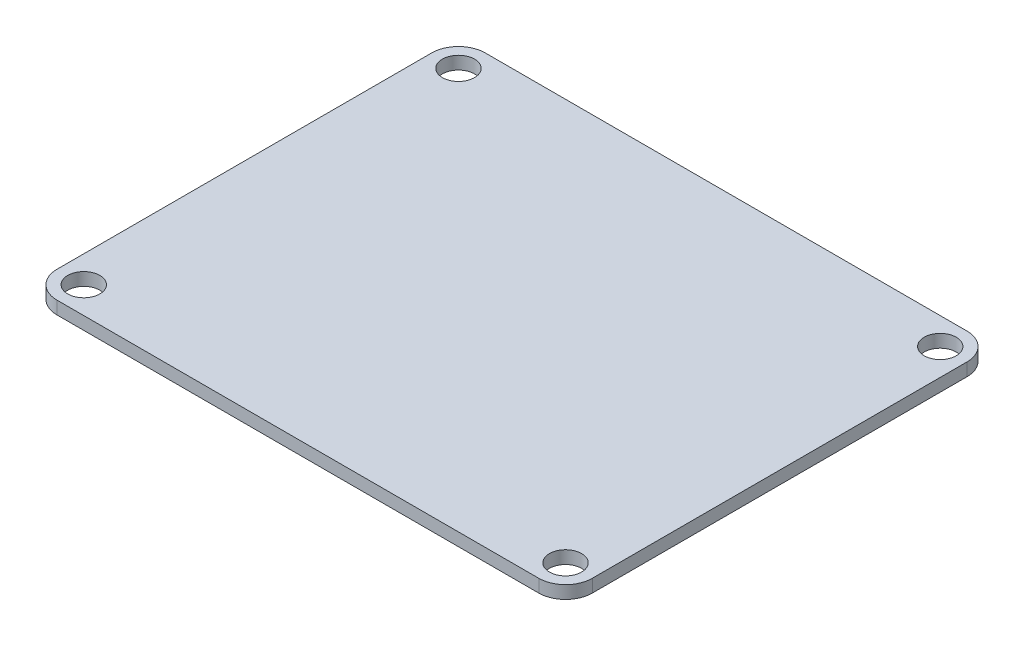
ISO-10303-21;
HEADER;
FILE_DESCRIPTION(('STEP AP214'),'2;1');
FILE_NAME('part.step','',(''),(''),'','','');
FILE_SCHEMA(('AUTOMOTIVE_DESIGN { 1 0 10303 214 1 1 1 1 }'));
ENDSEC;
DATA;
#1=APPLICATION_CONTEXT('core data for automotive mechanical design processes');
#2=APPLICATION_PROTOCOL_DEFINITION('international standard','automotive_design',2000,#1);
#3=PRODUCT_CONTEXT('',#1,'mechanical');
#4=PRODUCT('Part','Part','',(#3));
#5=PRODUCT_RELATED_PRODUCT_CATEGORY('part','',(#4));
#6=PRODUCT_DEFINITION_FORMATION('','',#4);
#7=PRODUCT_DEFINITION_CONTEXT('part definition',#1,'design');
#8=PRODUCT_DEFINITION('design','',#6,#7);
#9=PRODUCT_DEFINITION_SHAPE('','',#8);
#10=(LENGTH_UNIT() NAMED_UNIT(*) SI_UNIT(.MILLI.,.METRE.));
#11=(NAMED_UNIT(*) PLANE_ANGLE_UNIT() SI_UNIT($,.RADIAN.));
#12=(NAMED_UNIT(*) SI_UNIT($,.STERADIAN.) SOLID_ANGLE_UNIT());
#13=UNCERTAINTY_MEASURE_WITH_UNIT(LENGTH_MEASURE(1.E-05),#10,'distance_accuracy_value','');
#14=(GEOMETRIC_REPRESENTATION_CONTEXT(3) GLOBAL_UNCERTAINTY_ASSIGNED_CONTEXT((#13)) GLOBAL_UNIT_ASSIGNED_CONTEXT((#10,
#11,#12)) REPRESENTATION_CONTEXT('',''));
#15=CARTESIAN_POINT('',(0.,0.,0.));
#16=DIRECTION('',(0.,0.,1.));
#17=DIRECTION('',(1.,0.,0.));
#18=AXIS2_PLACEMENT_3D('',#15,#16,#17);
#19=CARTESIAN_POINT('',(-55.2139943562877,1.2,-17.0443805869234));
#20=DIRECTION('',(0.,-1.,0.));
#21=DIRECTION('',(0.,0.,-1.));
#22=AXIS2_PLACEMENT_3D('',#19,#20,#21);
#23=CYLINDRICAL_SURFACE('',#22,2.5);
#24=CARTESIAN_POINT('',(-55.2139943562877,0.,-17.0443805869234));
#25=DIRECTION('',(0.,1.,0.));
#26=DIRECTION('',(0.,0.,1.));
#27=AXIS2_PLACEMENT_3D('',#24,#25,#26);
#28=CIRCLE('',#27,2.5);
#29=CARTESIAN_POINT('',(-55.2139943562877,0.,-19.5443805869234));
#30=VERTEX_POINT('',#29);
#31=CARTESIAN_POINT('',(-57.7139943562877,0.,-17.0443805869234));
#32=VERTEX_POINT('',#31);
#33=EDGE_CURVE('E127',#30,#32,#28,.T.);
#34=ORIENTED_EDGE('',*,*,#33,.T.);
#35=DIRECTION('',(0.,-1.,0.));
#36=VECTOR('',#35,1.);
#37=CARTESIAN_POINT('',(-57.7139943562877,1.2,-17.0443805869234));
#38=LINE('',#37,#36);
#39=CARTESIAN_POINT('',(-57.7139943562877,1.2,-17.0443805869234));
#40=VERTEX_POINT('',#39);
#41=EDGE_CURVE('E11',#40,#32,#38,.T.);
#42=ORIENTED_EDGE('',*,*,#41,.F.);
#43=CARTESIAN_POINT('',(-55.2139943562877,1.2,-17.0443805869234));
#44=DIRECTION('',(0.,1.,0.));
#45=DIRECTION('',(0.,0.,1.));
#46=AXIS2_PLACEMENT_3D('',#43,#44,#45);
#47=CIRCLE('',#46,2.5);
#48=CARTESIAN_POINT('',(-55.2139943562877,1.2,-19.5443805869234));
#49=VERTEX_POINT('',#48);
#50=EDGE_CURVE('E142',#49,#40,#47,.T.);
#51=ORIENTED_EDGE('',*,*,#50,.F.);
#52=DIRECTION('',(0.,-1.,0.));
#53=VECTOR('',#52,1.);
#54=CARTESIAN_POINT('',(-55.2139943562877,1.2,-19.5443805869234));
#55=LINE('',#54,#53);
#56=EDGE_CURVE('E123',#49,#30,#55,.T.);
#57=ORIENTED_EDGE('',*,*,#56,.T.);
#58=EDGE_LOOP('',(#34,#42,#51,#57));
#59=FACE_BOUND('',#58,.T.);
#60=ADVANCED_FACE('F31',(#59),#23,.T.);
#61=CARTESIAN_POINT('',(-57.7139943562877,1.2,-17.0443805869234));
#62=DIRECTION('',(1.,0.,0.));
#63=DIRECTION('',(0.,0.,-1.));
#64=AXIS2_PLACEMENT_3D('',#61,#62,#63);
#65=PLANE('',#64);
#66=DIRECTION('',(0.,0.,1.));
#67=VECTOR('',#66,1.);
#68=CARTESIAN_POINT('',(-57.7139943562877,0.,-17.0443805869234));
#69=LINE('',#68,#67);
#70=CARTESIAN_POINT('',(-57.7139943562877,0.,17.9556194130766));
#71=VERTEX_POINT('',#70);
#72=EDGE_CURVE('E130',#32,#71,#69,.T.);
#73=ORIENTED_EDGE('',*,*,#72,.T.);
#74=DIRECTION('',(0.,-1.,0.));
#75=VECTOR('',#74,1.);
#76=CARTESIAN_POINT('',(-57.7139943562877,1.2,17.9556194130766));
#77=LINE('',#76,#75);
#78=CARTESIAN_POINT('',(-57.7139943562877,1.2,17.9556194130766));
#79=VERTEX_POINT('',#78);
#80=EDGE_CURVE('E39',#79,#71,#77,.T.);
#81=ORIENTED_EDGE('',*,*,#80,.F.);
#82=DIRECTION('',(0.,0.,1.));
#83=VECTOR('',#82,1.);
#84=CARTESIAN_POINT('',(-57.7139943562877,1.2,-17.0443805869234));
#85=LINE('',#84,#83);
#86=EDGE_CURVE('E90',#40,#79,#85,.T.);
#87=ORIENTED_EDGE('',*,*,#86,.F.);
#88=ORIENTED_EDGE('',*,*,#41,.T.);
#89=EDGE_LOOP('',(#73,#81,#87,#88));
#90=FACE_BOUND('',#89,.T.);
#91=ADVANCED_FACE('F232',(#90),#65,.F.);
#92=CARTESIAN_POINT('',(-55.2139943562877,1.2,17.9556194130766));
#93=DIRECTION('',(0.,-1.,0.));
#94=DIRECTION('',(0.,0.,-1.));
#95=AXIS2_PLACEMENT_3D('',#92,#93,#94);
#96=CYLINDRICAL_SURFACE('',#95,2.5);
#97=CARTESIAN_POINT('',(-55.2139943562877,0.,17.9556194130766));
#98=DIRECTION('',(0.,1.,0.));
#99=DIRECTION('',(0.,0.,1.));
#100=AXIS2_PLACEMENT_3D('',#97,#98,#99);
#101=CIRCLE('',#100,2.5);
#102=CARTESIAN_POINT('',(-55.2139943562877,0.,20.4556194130766));
#103=VERTEX_POINT('',#102);
#104=EDGE_CURVE('E133',#71,#103,#101,.T.);
#105=ORIENTED_EDGE('',*,*,#104,.T.);
#106=DIRECTION('',(0.,-1.,0.));
#107=VECTOR('',#106,1.);
#108=CARTESIAN_POINT('',(-55.2139943562877,1.2,20.4556194130766));
#109=LINE('',#108,#107);
#110=CARTESIAN_POINT('',(-55.2139943562877,1.2,20.4556194130766));
#111=VERTEX_POINT('',#110);
#112=EDGE_CURVE('E149',#111,#103,#109,.T.);
#113=ORIENTED_EDGE('',*,*,#112,.F.);
#114=CARTESIAN_POINT('',(-55.2139943562877,1.2,17.9556194130766));
#115=DIRECTION('',(0.,1.,0.));
#116=DIRECTION('',(0.,0.,1.));
#117=AXIS2_PLACEMENT_3D('',#114,#115,#116);
#118=CIRCLE('',#117,2.5);
#119=EDGE_CURVE('E157',#79,#111,#118,.T.);
#120=ORIENTED_EDGE('',*,*,#119,.F.);
#121=ORIENTED_EDGE('',*,*,#80,.T.);
#122=EDGE_LOOP('',(#105,#113,#120,#121));
#123=FACE_BOUND('',#122,.T.);
#124=ADVANCED_FACE('F155',(#123),#96,.T.);
#125=CARTESIAN_POINT('',(-55.2139943562877,1.2,20.4556194130766));
#126=DIRECTION('',(0.,0.,-1.));
#127=DIRECTION('',(-1.,0.,0.));
#128=AXIS2_PLACEMENT_3D('',#125,#126,#127);
#129=PLANE('',#128);
#130=DIRECTION('',(1.,0.,0.));
#131=VECTOR('',#130,1.);
#132=CARTESIAN_POINT('',(-55.2139943562877,0.,20.4556194130766));
#133=LINE('',#132,#131);
#134=CARTESIAN_POINT('',(-10.2139943562877,0.,20.4556194130766));
#135=VERTEX_POINT('',#134);
#136=EDGE_CURVE('E135',#103,#135,#133,.T.);
#137=ORIENTED_EDGE('',*,*,#136,.T.);
#138=DIRECTION('',(0.,-1.,0.));
#139=VECTOR('',#138,1.);
#140=CARTESIAN_POINT('',(-10.2139943562877,1.2,20.4556194130766));
#141=LINE('',#140,#139);
#142=CARTESIAN_POINT('',(-10.2139943562877,1.2,20.4556194130766));
#143=VERTEX_POINT('',#142);
#144=EDGE_CURVE('E146',#143,#135,#141,.T.);
#145=ORIENTED_EDGE('',*,*,#144,.F.);
#146=DIRECTION('',(1.,0.,0.));
#147=VECTOR('',#146,1.);
#148=CARTESIAN_POINT('',(-55.2139943562877,1.2,20.4556194130766));
#149=LINE('',#148,#147);
#150=EDGE_CURVE('E169',#111,#143,#149,.T.);
#151=ORIENTED_EDGE('',*,*,#150,.F.);
#152=ORIENTED_EDGE('',*,*,#112,.T.);
#153=EDGE_LOOP('',(#137,#145,#151,#152));
#154=FACE_BOUND('',#153,.T.);
#155=ADVANCED_FACE('F165',(#154),#129,.F.);
#156=CARTESIAN_POINT('',(-10.2139943562877,1.2,17.9556194130766));
#157=DIRECTION('',(0.,-1.,0.));
#158=DIRECTION('',(0.,0.,-1.));
#159=AXIS2_PLACEMENT_3D('',#156,#157,#158);
#160=CYLINDRICAL_SURFACE('',#159,2.5);
#161=CARTESIAN_POINT('',(-10.2139943562877,0.,17.9556194130766));
#162=DIRECTION('',(0.,1.,0.));
#163=DIRECTION('',(0.,0.,1.));
#164=AXIS2_PLACEMENT_3D('',#161,#162,#163);
#165=CIRCLE('',#164,2.5);
#166=CARTESIAN_POINT('',(-7.71399435628767,0.,17.9556194130766));
#167=VERTEX_POINT('',#166);
#168=EDGE_CURVE('E137',#135,#167,#165,.T.);
#169=ORIENTED_EDGE('',*,*,#168,.T.);
#170=DIRECTION('',(0.,-1.,0.));
#171=VECTOR('',#170,1.);
#172=CARTESIAN_POINT('',(-7.71399435628767,1.2,17.9556194130766));
#173=LINE('',#172,#171);
#174=CARTESIAN_POINT('',(-7.71399435628767,1.2,17.9556194130766));
#175=VERTEX_POINT('',#174);
#176=EDGE_CURVE('E118',#175,#167,#173,.T.);
#177=ORIENTED_EDGE('',*,*,#176,.F.);
#178=CARTESIAN_POINT('',(-10.2139943562877,1.2,17.9556194130766));
#179=DIRECTION('',(0.,1.,0.));
#180=DIRECTION('',(0.,0.,1.));
#181=AXIS2_PLACEMENT_3D('',#178,#179,#180);
#182=CIRCLE('',#181,2.5);
#183=EDGE_CURVE('E109',#143,#175,#182,.T.);
#184=ORIENTED_EDGE('',*,*,#183,.F.);
#185=ORIENTED_EDGE('',*,*,#144,.T.);
#186=EDGE_LOOP('',(#169,#177,#184,#185));
#187=FACE_BOUND('',#186,.T.);
#188=ADVANCED_FACE('F168',(#187),#160,.T.);
#189=CARTESIAN_POINT('',(-7.71399435628767,1.2,-17.0443805869234));
#190=DIRECTION('',(-1.,0.,0.));
#191=DIRECTION('',(0.,0.,1.));
#192=AXIS2_PLACEMENT_3D('',#189,#190,#191);
#193=PLANE('',#192);
#194=DIRECTION('',(0.,0.,-1.));
#195=VECTOR('',#194,1.);
#196=CARTESIAN_POINT('',(-7.71399435628767,0.,-17.0443805869234));
#197=LINE('',#196,#195);
#198=CARTESIAN_POINT('',(-7.71399435628767,0.,-17.0443805869234));
#199=VERTEX_POINT('',#198);
#200=EDGE_CURVE('E117',#167,#199,#197,.T.);
#201=ORIENTED_EDGE('',*,*,#200,.T.);
#202=DIRECTION('',(0.,-1.,0.));
#203=VECTOR('',#202,1.);
#204=CARTESIAN_POINT('',(-7.71399435628767,1.2,-17.0443805869234));
#205=LINE('',#204,#203);
#206=CARTESIAN_POINT('',(-7.71399435628767,1.2,-17.0443805869234));
#207=VERTEX_POINT('',#206);
#208=EDGE_CURVE('E114',#207,#199,#205,.T.);
#209=ORIENTED_EDGE('',*,*,#208,.F.);
#210=DIRECTION('',(0.,0.,-1.));
#211=VECTOR('',#210,1.);
#212=CARTESIAN_POINT('',(-7.71399435628767,1.2,-17.0443805869234));
#213=LINE('',#212,#211);
#214=EDGE_CURVE('E103',#175,#207,#213,.T.);
#215=ORIENTED_EDGE('',*,*,#214,.F.);
#216=ORIENTED_EDGE('',*,*,#176,.T.);
#217=EDGE_LOOP('',(#201,#209,#215,#216));
#218=FACE_BOUND('',#217,.T.);
#219=ADVANCED_FACE('F115',(#218),#193,.F.);
#220=CARTESIAN_POINT('',(-10.2139943562877,1.2,-17.0443805869234));
#221=DIRECTION('',(0.,-1.,0.));
#222=DIRECTION('',(0.,0.,-1.));
#223=AXIS2_PLACEMENT_3D('',#220,#221,#222);
#224=CYLINDRICAL_SURFACE('',#223,2.5);
#225=CARTESIAN_POINT('',(-10.2139943562877,0.,-17.0443805869234));
#226=DIRECTION('',(0.,1.,0.));
#227=DIRECTION('',(0.,0.,1.));
#228=AXIS2_PLACEMENT_3D('',#225,#226,#227);
#229=CIRCLE('',#228,2.5);
#230=CARTESIAN_POINT('',(-10.2139943562877,0.,-19.5443805869234));
#231=VERTEX_POINT('',#230);
#232=EDGE_CURVE('E76',#199,#231,#229,.T.);
#233=ORIENTED_EDGE('',*,*,#232,.T.);
#234=DIRECTION('',(0.,-1.,0.));
#235=VECTOR('',#234,1.);
#236=CARTESIAN_POINT('',(-10.2139943562877,1.2,-19.5443805869234));
#237=LINE('',#236,#235);
#238=CARTESIAN_POINT('',(-10.2139943562877,1.2,-19.5443805869234));
#239=VERTEX_POINT('',#238);
#240=EDGE_CURVE('E119',#239,#231,#237,.T.);
#241=ORIENTED_EDGE('',*,*,#240,.F.);
#242=CARTESIAN_POINT('',(-10.2139943562877,1.2,-17.0443805869234));
#243=DIRECTION('',(0.,1.,0.));
#244=DIRECTION('',(0.,0.,1.));
#245=AXIS2_PLACEMENT_3D('',#242,#243,#244);
#246=CIRCLE('',#245,2.5);
#247=EDGE_CURVE('E107',#207,#239,#246,.T.);
#248=ORIENTED_EDGE('',*,*,#247,.F.);
#249=ORIENTED_EDGE('',*,*,#208,.T.);
#250=EDGE_LOOP('',(#233,#241,#248,#249));
#251=FACE_BOUND('',#250,.T.);
#252=ADVANCED_FACE('F121',(#251),#224,.T.);
#253=CARTESIAN_POINT('',(-55.2139943562877,1.2,-19.5443805869234));
#254=DIRECTION('',(0.,0.,1.));
#255=DIRECTION('',(1.,0.,0.));
#256=AXIS2_PLACEMENT_3D('',#253,#254,#255);
#257=PLANE('',#256);
#258=DIRECTION('',(-1.,0.,0.));
#259=VECTOR('',#258,1.);
#260=CARTESIAN_POINT('',(-55.2139943562877,0.,-19.5443805869234));
#261=LINE('',#260,#259);
#262=EDGE_CURVE('E82',#231,#30,#261,.T.);
#263=ORIENTED_EDGE('',*,*,#262,.T.);
#264=ORIENTED_EDGE('',*,*,#56,.F.);
#265=DIRECTION('',(-1.,0.,0.));
#266=VECTOR('',#265,1.);
#267=CARTESIAN_POINT('',(-55.2139943562877,1.2,-19.5443805869234));
#268=LINE('',#267,#266);
#269=EDGE_CURVE('E47',#239,#49,#268,.T.);
#270=ORIENTED_EDGE('',*,*,#269,.F.);
#271=ORIENTED_EDGE('',*,*,#240,.T.);
#272=EDGE_LOOP('',(#263,#264,#270,#271));
#273=FACE_BOUND('',#272,.T.);
#274=ADVANCED_FACE('F210',(#273),#257,.F.);
#275=CARTESIAN_POINT('',(-55.2139943562877,1.2,-17.0443805869234));
#276=DIRECTION('',(0.,1.,0.));
#277=DIRECTION('',(0.,0.,1.));
#278=AXIS2_PLACEMENT_3D('',#275,#276,#277);
#279=PLANE('',#278);
#280=CARTESIAN_POINT('',(-10.2139943562877,1.2,17.9556194130766));
#281=DIRECTION('',(0.,1.,0.));
#282=DIRECTION('',(0.,0.,1.));
#283=AXIS2_PLACEMENT_3D('',#280,#281,#282);
#284=CIRCLE('',#283,1.5);
#285=CARTESIAN_POINT('',(-10.2139943562877,1.2,19.4556194130766));
#286=VERTEX_POINT('',#285);
#287=EDGE_CURVE('E193',#286,#286,#284,.T.);
#288=ORIENTED_EDGE('',*,*,#287,.F.);
#289=EDGE_LOOP('',(#288));
#290=FACE_BOUND('',#289,.T.);
#291=CARTESIAN_POINT('',(-55.2139943562876,1.2,17.9556194130766));
#292=DIRECTION('',(0.,1.,0.));
#293=DIRECTION('',(0.,0.,1.));
#294=AXIS2_PLACEMENT_3D('',#291,#292,#293);
#295=CIRCLE('',#294,1.5);
#296=CARTESIAN_POINT('',(-55.2139943562876,1.2,19.4556194130766));
#297=VERTEX_POINT('',#296);
#298=EDGE_CURVE('E187',#297,#297,#295,.T.);
#299=ORIENTED_EDGE('',*,*,#298,.F.);
#300=EDGE_LOOP('',(#299));
#301=FACE_BOUND('',#300,.T.);
#302=CARTESIAN_POINT('',(-10.2139943562877,1.2,-17.0443805869234));
#303=DIRECTION('',(0.,1.,0.));
#304=DIRECTION('',(0.,0.,1.));
#305=AXIS2_PLACEMENT_3D('',#302,#303,#304);
#306=CIRCLE('',#305,1.5);
#307=CARTESIAN_POINT('',(-10.2139943562877,1.2,-15.5443805869234));
#308=VERTEX_POINT('',#307);
#309=EDGE_CURVE('E181',#308,#308,#306,.T.);
#310=ORIENTED_EDGE('',*,*,#309,.F.);
#311=EDGE_LOOP('',(#310));
#312=FACE_BOUND('',#311,.T.);
#313=CARTESIAN_POINT('',(-55.2139943562876,1.2,-17.0443805869234));
#314=DIRECTION('',(0.,1.,0.));
#315=DIRECTION('',(0.,0.,1.));
#316=AXIS2_PLACEMENT_3D('',#313,#314,#315);
#317=CIRCLE('',#316,1.5);
#318=CARTESIAN_POINT('',(-55.2139943562876,1.2,-15.5443805869234));
#319=VERTEX_POINT('',#318);
#320=EDGE_CURVE('E175',#319,#319,#317,.T.);
#321=ORIENTED_EDGE('',*,*,#320,.F.);
#322=EDGE_LOOP('',(#321));
#323=FACE_BOUND('',#322,.T.);
#324=ORIENTED_EDGE('',*,*,#50,.T.);
#325=ORIENTED_EDGE('',*,*,#86,.T.);
#326=ORIENTED_EDGE('',*,*,#119,.T.);
#327=ORIENTED_EDGE('',*,*,#150,.T.);
#328=ORIENTED_EDGE('',*,*,#183,.T.);
#329=ORIENTED_EDGE('',*,*,#214,.T.);
#330=ORIENTED_EDGE('',*,*,#247,.T.);
#331=ORIENTED_EDGE('',*,*,#269,.T.);
#332=EDGE_LOOP('',(#324,#325,#326,#327,#328,#329,#330,#331));
#333=FACE_BOUND('',#332,.T.);
#334=ADVANCED_FACE('F105',(#290,#301,#312,#323,#333),#279,.T.);
#335=CARTESIAN_POINT('',(-55.2139943562877,0.,-17.0443805869234));
#336=DIRECTION('',(0.,1.,0.));
#337=DIRECTION('',(0.,0.,1.));
#338=AXIS2_PLACEMENT_3D('',#335,#336,#337);
#339=PLANE('',#338);
#340=CARTESIAN_POINT('',(-10.2139943562877,0.,17.9556194130766));
#341=DIRECTION('',(0.,1.,0.));
#342=DIRECTION('',(0.,0.,1.));
#343=AXIS2_PLACEMENT_3D('',#340,#341,#342);
#344=CIRCLE('',#343,1.5);
#345=CARTESIAN_POINT('',(-10.2139943562877,0.,19.4556194130766));
#346=VERTEX_POINT('',#345);
#347=EDGE_CURVE('E190',#346,#346,#344,.T.);
#348=ORIENTED_EDGE('',*,*,#347,.T.);
#349=EDGE_LOOP('',(#348));
#350=FACE_BOUND('',#349,.T.);
#351=CARTESIAN_POINT('',(-55.2139943562876,0.,17.9556194130766));
#352=DIRECTION('',(0.,1.,0.));
#353=DIRECTION('',(0.,0.,1.));
#354=AXIS2_PLACEMENT_3D('',#351,#352,#353);
#355=CIRCLE('',#354,1.5);
#356=CARTESIAN_POINT('',(-55.2139943562876,0.,19.4556194130766));
#357=VERTEX_POINT('',#356);
#358=EDGE_CURVE('E184',#357,#357,#355,.T.);
#359=ORIENTED_EDGE('',*,*,#358,.T.);
#360=EDGE_LOOP('',(#359));
#361=FACE_BOUND('',#360,.T.);
#362=CARTESIAN_POINT('',(-10.2139943562877,0.,-17.0443805869234));
#363=DIRECTION('',(0.,1.,0.));
#364=DIRECTION('',(0.,0.,1.));
#365=AXIS2_PLACEMENT_3D('',#362,#363,#364);
#366=CIRCLE('',#365,1.5);
#367=CARTESIAN_POINT('',(-10.2139943562877,0.,-15.5443805869234));
#368=VERTEX_POINT('',#367);
#369=EDGE_CURVE('E178',#368,#368,#366,.T.);
#370=ORIENTED_EDGE('',*,*,#369,.T.);
#371=EDGE_LOOP('',(#370));
#372=FACE_BOUND('',#371,.T.);
#373=CARTESIAN_POINT('',(-55.2139943562876,0.,-17.0443805869234));
#374=DIRECTION('',(0.,1.,0.));
#375=DIRECTION('',(0.,0.,1.));
#376=AXIS2_PLACEMENT_3D('',#373,#374,#375);
#377=CIRCLE('',#376,1.5);
#378=CARTESIAN_POINT('',(-55.2139943562876,0.,-15.5443805869234));
#379=VERTEX_POINT('',#378);
#380=EDGE_CURVE('E131',#379,#379,#377,.T.);
#381=ORIENTED_EDGE('',*,*,#380,.T.);
#382=EDGE_LOOP('',(#381));
#383=FACE_BOUND('',#382,.T.);
#384=ORIENTED_EDGE('',*,*,#33,.F.);
#385=ORIENTED_EDGE('',*,*,#262,.F.);
#386=ORIENTED_EDGE('',*,*,#232,.F.);
#387=ORIENTED_EDGE('',*,*,#200,.F.);
#388=ORIENTED_EDGE('',*,*,#168,.F.);
#389=ORIENTED_EDGE('',*,*,#136,.F.);
#390=ORIENTED_EDGE('',*,*,#104,.F.);
#391=ORIENTED_EDGE('',*,*,#72,.F.);
#392=EDGE_LOOP('',(#384,#385,#386,#387,#388,#389,#390,#391));
#393=FACE_BOUND('',#392,.T.);
#394=ADVANCED_FACE('F161',(#350,#361,#372,#383,#393),#339,.F.);
#395=CARTESIAN_POINT('',(-55.2139943562876,0.,-17.0443805869234));
#396=DIRECTION('',(0.,1.,0.));
#397=DIRECTION('',(0.,0.,1.));
#398=AXIS2_PLACEMENT_3D('',#395,#396,#397);
#399=CYLINDRICAL_SURFACE('',#398,1.5);
#400=ORIENTED_EDGE('',*,*,#380,.F.);
#401=EDGE_LOOP('',(#400));
#402=FACE_BOUND('',#401,.T.);
#403=ORIENTED_EDGE('',*,*,#320,.T.);
#404=EDGE_LOOP('',(#403));
#405=FACE_BOUND('',#404,.T.);
#406=ADVANCED_FACE('F218',(#402,#405),#399,.F.);
#407=CARTESIAN_POINT('',(-10.2139943562877,0.,-17.0443805869234));
#408=DIRECTION('',(0.,1.,0.));
#409=DIRECTION('',(0.,0.,1.));
#410=AXIS2_PLACEMENT_3D('',#407,#408,#409);
#411=CYLINDRICAL_SURFACE('',#410,1.5);
#412=ORIENTED_EDGE('',*,*,#369,.F.);
#413=EDGE_LOOP('',(#412));
#414=FACE_BOUND('',#413,.T.);
#415=ORIENTED_EDGE('',*,*,#309,.T.);
#416=EDGE_LOOP('',(#415));
#417=FACE_BOUND('',#416,.T.);
#418=ADVANCED_FACE('F220',(#414,#417),#411,.F.);
#419=CARTESIAN_POINT('',(-55.2139943562876,0.,17.9556194130766));
#420=DIRECTION('',(0.,1.,0.));
#421=DIRECTION('',(0.,0.,1.));
#422=AXIS2_PLACEMENT_3D('',#419,#420,#421);
#423=CYLINDRICAL_SURFACE('',#422,1.5);
#424=ORIENTED_EDGE('',*,*,#358,.F.);
#425=EDGE_LOOP('',(#424));
#426=FACE_BOUND('',#425,.T.);
#427=ORIENTED_EDGE('',*,*,#298,.T.);
#428=EDGE_LOOP('',(#427));
#429=FACE_BOUND('',#428,.T.);
#430=ADVANCED_FACE('F204',(#426,#429),#423,.F.);
#431=CARTESIAN_POINT('',(-10.2139943562877,0.,17.9556194130766));
#432=DIRECTION('',(0.,1.,0.));
#433=DIRECTION('',(0.,0.,1.));
#434=AXIS2_PLACEMENT_3D('',#431,#432,#433);
#435=CYLINDRICAL_SURFACE('',#434,1.5);
#436=ORIENTED_EDGE('',*,*,#347,.F.);
#437=EDGE_LOOP('',(#436));
#438=FACE_BOUND('',#437,.T.);
#439=ORIENTED_EDGE('',*,*,#287,.T.);
#440=EDGE_LOOP('',(#439));
#441=FACE_BOUND('',#440,.T.);
#442=ADVANCED_FACE('F201',(#438,#441),#435,.F.);
#443=CLOSED_SHELL('',(#60,#91,#124,#155,#188,#219,#252,#274,#334,#394,#406,#418,#430,#442));
#444=MANIFOLD_SOLID_BREP('B2',#443);
#445=ADVANCED_BREP_SHAPE_REPRESENTATION('',(#18,#444),#14);
#446=SHAPE_DEFINITION_REPRESENTATION(#9,#445);
ENDSEC;
END-ISO-10303-21;
